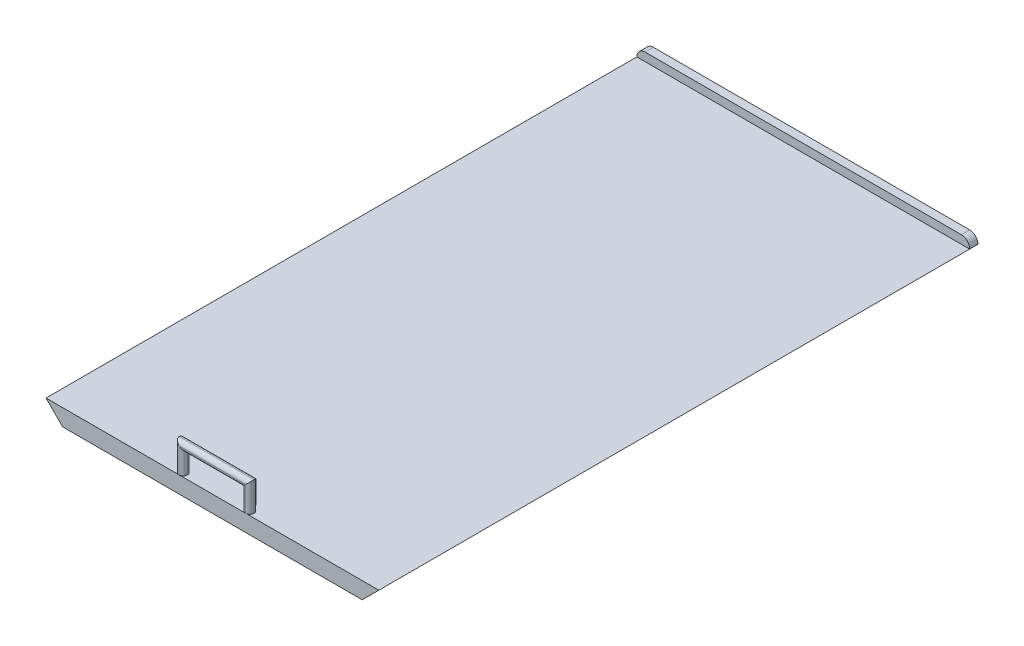
ISO-10303-21;
HEADER;
FILE_DESCRIPTION(('STEP AP214'),'2;1');
FILE_NAME('part.step','',(''),(''),'','','');
FILE_SCHEMA(('AUTOMOTIVE_DESIGN { 1 0 10303 214 1 1 1 1 }'));
ENDSEC;
DATA;
#1=APPLICATION_CONTEXT('core data for automotive mechanical design processes');
#2=APPLICATION_PROTOCOL_DEFINITION('international standard','automotive_design',2000,#1);
#3=PRODUCT_CONTEXT('',#1,'mechanical');
#4=PRODUCT('Part','Part','',(#3));
#5=PRODUCT_RELATED_PRODUCT_CATEGORY('part','',(#4));
#6=PRODUCT_DEFINITION_FORMATION('','',#4);
#7=PRODUCT_DEFINITION_CONTEXT('part definition',#1,'design');
#8=PRODUCT_DEFINITION('design','',#6,#7);
#9=PRODUCT_DEFINITION_SHAPE('','',#8);
#10=(LENGTH_UNIT() NAMED_UNIT(*) SI_UNIT(.MILLI.,.METRE.));
#11=(NAMED_UNIT(*) PLANE_ANGLE_UNIT() SI_UNIT($,.RADIAN.));
#12=(NAMED_UNIT(*) SI_UNIT($,.STERADIAN.) SOLID_ANGLE_UNIT());
#13=UNCERTAINTY_MEASURE_WITH_UNIT(LENGTH_MEASURE(1.E-05),#10,'distance_accuracy_value','');
#14=(GEOMETRIC_REPRESENTATION_CONTEXT(3) GLOBAL_UNCERTAINTY_ASSIGNED_CONTEXT((#13)) GLOBAL_UNIT_ASSIGNED_CONTEXT((#10,
#11,#12)) REPRESENTATION_CONTEXT('',''));
#15=CARTESIAN_POINT('',(0.,0.,0.));
#16=DIRECTION('',(0.,0.,1.));
#17=DIRECTION('',(1.,0.,0.));
#18=AXIS2_PLACEMENT_3D('',#15,#16,#17);
#19=CARTESIAN_POINT('',(0.,0.,1.));
#20=DIRECTION('',(0.,-1.,0.));
#21=DIRECTION('',(0.,0.,-1.));
#22=AXIS2_PLACEMENT_3D('',#19,#20,#21);
#23=PLANE('',#22);
#24=DIRECTION('',(-1.,0.,0.));
#25=VECTOR('',#24,1.);
#26=CARTESIAN_POINT('',(0.,0.,0.));
#27=LINE('',#26,#25);
#28=CARTESIAN_POINT('',(40.,0.,0.));
#29=VERTEX_POINT('',#28);
#30=CARTESIAN_POINT('',(0.,0.,0.));
#31=VERTEX_POINT('',#30);
#32=EDGE_CURVE('E120',#29,#31,#27,.T.);
#33=ORIENTED_EDGE('',*,*,#32,.F.);
#34=DIRECTION('',(0.,0.,-1.));
#35=VECTOR('',#34,1.);
#36=CARTESIAN_POINT('',(40.,0.,1.));
#37=LINE('',#36,#35);
#38=CARTESIAN_POINT('',(40.,0.,1.));
#39=VERTEX_POINT('',#38);
#40=EDGE_CURVE('E98',#39,#29,#37,.T.);
#41=ORIENTED_EDGE('',*,*,#40,.F.);
#42=DIRECTION('',(-1.,0.,0.));
#43=VECTOR('',#42,1.);
#44=CARTESIAN_POINT('',(0.,0.,1.));
#45=LINE('',#44,#43);
#46=CARTESIAN_POINT('',(0.,0.,1.));
#47=VERTEX_POINT('',#46);
#48=EDGE_CURVE('E88',#39,#47,#45,.T.);
#49=ORIENTED_EDGE('',*,*,#48,.T.);
#50=DIRECTION('',(0.,0.,-1.));
#51=VECTOR('',#50,1.);
#52=CARTESIAN_POINT('',(0.,0.,1.));
#53=LINE('',#52,#51);
#54=EDGE_CURVE('E95',#47,#31,#53,.T.);
#55=ORIENTED_EDGE('',*,*,#54,.T.);
#56=EDGE_LOOP('',(#33,#41,#49,#55));
#57=FACE_BOUND('',#56,.T.);
#58=ADVANCED_FACE('F47',(#57),#23,.T.);
#59=CARTESIAN_POINT('',(0.,1.,1.));
#60=DIRECTION('',(0.,1.,0.));
#61=DIRECTION('',(0.,0.,1.));
#62=AXIS2_PLACEMENT_3D('',#59,#60,#61);
#63=PLANE('',#62);
#64=DIRECTION('',(1.,0.,0.));
#65=VECTOR('',#64,1.);
#66=CARTESIAN_POINT('',(0.,1.,0.));
#67=LINE('',#66,#65);
#68=CARTESIAN_POINT('',(1.,1.,0.));
#69=VERTEX_POINT('',#68);
#70=CARTESIAN_POINT('',(39.,1.,0.));
#71=VERTEX_POINT('',#70);
#72=EDGE_CURVE('E99',#69,#71,#67,.T.);
#73=ORIENTED_EDGE('',*,*,#72,.F.);
#74=DIRECTION('',(0.,0.,-1.));
#75=VECTOR('',#74,1.);
#76=CARTESIAN_POINT('',(1.,1.,1.));
#77=LINE('',#76,#75);
#78=CARTESIAN_POINT('',(1.,1.,1.));
#79=VERTEX_POINT('',#78);
#80=EDGE_CURVE('E68',#69,#79,#77,.F.);
#81=ORIENTED_EDGE('',*,*,#80,.T.);
#82=DIRECTION('',(1.,0.,0.));
#83=VECTOR('',#82,1.);
#84=CARTESIAN_POINT('',(0.,1.,1.));
#85=LINE('',#84,#83);
#86=CARTESIAN_POINT('',(39.,1.,1.));
#87=VERTEX_POINT('',#86);
#88=EDGE_CURVE('E89',#79,#87,#85,.T.);
#89=ORIENTED_EDGE('',*,*,#88,.T.);
#90=DIRECTION('',(0.,0.,-1.));
#91=VECTOR('',#90,1.);
#92=CARTESIAN_POINT('',(39.,1.,1.));
#93=LINE('',#92,#91);
#94=EDGE_CURVE('E111',#87,#71,#93,.T.);
#95=ORIENTED_EDGE('',*,*,#94,.T.);
#96=EDGE_LOOP('',(#73,#81,#89,#95));
#97=FACE_BOUND('',#96,.T.);
#98=ADVANCED_FACE('F116',(#97),#63,.T.);
#99=CARTESIAN_POINT('',(0.,0.,1.));
#100=DIRECTION('',(0.,0.,1.));
#101=DIRECTION('',(1.,0.,0.));
#102=AXIS2_PLACEMENT_3D('',#99,#100,#101);
#103=PLANE('',#102);
#104=ORIENTED_EDGE('',*,*,#88,.F.);
#105=CARTESIAN_POINT('',(1.,0.,1.));
#106=DIRECTION('',(0.,0.,1.));
#107=DIRECTION('',(1.,0.,0.));
#108=AXIS2_PLACEMENT_3D('',#105,#106,#107);
#109=CIRCLE('',#108,1.);
#110=EDGE_CURVE('E12',#79,#47,#109,.T.);
#111=ORIENTED_EDGE('',*,*,#110,.T.);
#112=ORIENTED_EDGE('',*,*,#48,.F.);
#113=CARTESIAN_POINT('',(39.,0.,1.));
#114=DIRECTION('',(0.,0.,1.));
#115=DIRECTION('',(1.,0.,0.));
#116=AXIS2_PLACEMENT_3D('',#113,#114,#115);
#117=CIRCLE('',#116,1.);
#118=EDGE_CURVE('E55',#39,#87,#117,.T.);
#119=ORIENTED_EDGE('',*,*,#118,.T.);
#120=EDGE_LOOP('',(#104,#111,#112,#119));
#121=FACE_BOUND('',#120,.T.);
#122=ADVANCED_FACE('F87',(#121),#103,.T.);
#123=CARTESIAN_POINT('',(0.,0.,0.));
#124=DIRECTION('',(0.,0.,1.));
#125=DIRECTION('',(1.,0.,0.));
#126=AXIS2_PLACEMENT_3D('',#123,#124,#125);
#127=PLANE('',#126);
#128=ORIENTED_EDGE('',*,*,#32,.T.);
#129=CARTESIAN_POINT('',(1.,0.,0.));
#130=DIRECTION('',(0.,0.,1.));
#131=DIRECTION('',(1.,0.,0.));
#132=AXIS2_PLACEMENT_3D('',#129,#130,#131);
#133=CIRCLE('',#132,1.);
#134=EDGE_CURVE('E102',#31,#69,#133,.F.);
#135=ORIENTED_EDGE('',*,*,#134,.T.);
#136=ORIENTED_EDGE('',*,*,#72,.T.);
#137=CARTESIAN_POINT('',(39.,0.,0.));
#138=DIRECTION('',(0.,0.,1.));
#139=DIRECTION('',(1.,0.,0.));
#140=AXIS2_PLACEMENT_3D('',#137,#138,#139);
#141=CIRCLE('',#140,1.);
#142=EDGE_CURVE('E104',#71,#29,#141,.F.);
#143=ORIENTED_EDGE('',*,*,#142,.T.);
#144=EDGE_LOOP('',(#128,#135,#136,#143));
#145=FACE_BOUND('',#144,.T.);
#146=ADVANCED_FACE('F119',(#145),#127,.F.);
#147=CARTESIAN_POINT('',(1.,0.,1.));
#148=DIRECTION('',(0.,0.,-1.));
#149=DIRECTION('',(-1.,0.,0.));
#150=AXIS2_PLACEMENT_3D('',#147,#148,#149);
#151=CYLINDRICAL_SURFACE('',#150,1.);
#152=ORIENTED_EDGE('',*,*,#110,.F.);
#153=ORIENTED_EDGE('',*,*,#80,.F.);
#154=ORIENTED_EDGE('',*,*,#134,.F.);
#155=ORIENTED_EDGE('',*,*,#54,.F.);
#156=EDGE_LOOP('',(#152,#153,#154,#155));
#157=FACE_BOUND('',#156,.T.);
#158=ADVANCED_FACE('F101',(#157),#151,.T.);
#159=CARTESIAN_POINT('',(39.,0.,1.));
#160=DIRECTION('',(0.,0.,-1.));
#161=DIRECTION('',(-1.,0.,0.));
#162=AXIS2_PLACEMENT_3D('',#159,#160,#161);
#163=CYLINDRICAL_SURFACE('',#162,1.);
#164=ORIENTED_EDGE('',*,*,#118,.F.);
#165=ORIENTED_EDGE('',*,*,#40,.T.);
#166=ORIENTED_EDGE('',*,*,#142,.F.);
#167=ORIENTED_EDGE('',*,*,#94,.F.);
#168=EDGE_LOOP('',(#164,#165,#166,#167));
#169=FACE_BOUND('',#168,.T.);
#170=ADVANCED_FACE('F49',(#169),#163,.T.);
#171=CLOSED_SHELL('',(#58,#98,#122,#146,#158,#170));
#172=MANIFOLD_SOLID_BREP('B2',#171);
#173=CARTESIAN_POINT('',(0.,0.,72.));
#174=DIRECTION('',(0.,-1.,0.));
#175=DIRECTION('',(0.,0.,-1.));
#176=AXIS2_PLACEMENT_3D('',#173,#174,#175);
#177=PLANE('',#176);
#178=DIRECTION('',(-1.,0.,0.));
#179=VECTOR('',#178,1.);
#180=CARTESIAN_POINT('',(0.,0.,72.));
#181=LINE('',#180,#179);
#182=CARTESIAN_POINT('',(16.,0.,72.));
#183=VERTEX_POINT('',#182);
#184=CARTESIAN_POINT('',(0.,0.,72.));
#185=VERTEX_POINT('',#184);
#186=EDGE_CURVE('E378',#183,#185,#181,.T.);
#187=ORIENTED_EDGE('',*,*,#186,.F.);
#188=CARTESIAN_POINT('',(16.,0.,71.5));
#189=DIRECTION('',(0.,-1.,0.));
#190=DIRECTION('',(0.,0.,-1.));
#191=AXIS2_PLACEMENT_3D('',#188,#189,#190);
#192=CIRCLE('',#191,0.5);
#193=CARTESIAN_POINT('',(15.5,0.,71.5));
#194=VERTEX_POINT('',#193);
#195=EDGE_CURVE('E45',#183,#194,#192,.T.);
#196=ORIENTED_EDGE('',*,*,#195,.T.);
#197=CARTESIAN_POINT('',(16.,0.,71.5));
#198=DIRECTION('',(0.,-1.,0.));
#199=DIRECTION('',(0.,0.,-1.));
#200=AXIS2_PLACEMENT_3D('',#197,#198,#199);
#201=CIRCLE('',#200,0.5);
#202=CARTESIAN_POINT('',(16.,0.,71.));
#203=VERTEX_POINT('',#202);
#204=EDGE_CURVE('E181',#194,#203,#201,.T.);
#205=ORIENTED_EDGE('',*,*,#204,.T.);
#206=CARTESIAN_POINT('',(16.,0.,71.5));
#207=DIRECTION('',(0.,-1.,0.));
#208=DIRECTION('',(0.,0.,-1.));
#209=AXIS2_PLACEMENT_3D('',#206,#207,#208);
#210=CIRCLE('',#209,0.5);
#211=CARTESIAN_POINT('',(16.5,0.,71.5));
#212=VERTEX_POINT('',#211);
#213=EDGE_CURVE('E287',#203,#212,#210,.T.);
#214=ORIENTED_EDGE('',*,*,#213,.T.);
#215=CARTESIAN_POINT('',(16.,0.,71.5));
#216=DIRECTION('',(0.,-1.,0.));
#217=DIRECTION('',(0.,0.,-1.));
#218=AXIS2_PLACEMENT_3D('',#215,#216,#217);
#219=CIRCLE('',#218,0.5);
#220=EDGE_CURVE('E277',#212,#183,#219,.T.);
#221=ORIENTED_EDGE('',*,*,#220,.T.);
#222=CARTESIAN_POINT('',(24.,0.,72.));
#223=VERTEX_POINT('',#222);
#224=EDGE_CURVE('E376',#223,#183,#181,.T.);
#225=ORIENTED_EDGE('',*,*,#224,.F.);
#226=CARTESIAN_POINT('',(24.,0.,71.5));
#227=DIRECTION('',(0.,-1.,0.));
#228=DIRECTION('',(0.,0.,-1.));
#229=AXIS2_PLACEMENT_3D('',#226,#227,#228);
#230=CIRCLE('',#229,0.5);
#231=CARTESIAN_POINT('',(23.5,0.,71.5));
#232=VERTEX_POINT('',#231);
#233=EDGE_CURVE('E272',#223,#232,#230,.T.);
#234=ORIENTED_EDGE('',*,*,#233,.T.);
#235=CARTESIAN_POINT('',(24.,0.,71.5));
#236=DIRECTION('',(0.,-1.,0.));
#237=DIRECTION('',(0.,0.,-1.));
#238=AXIS2_PLACEMENT_3D('',#235,#236,#237);
#239=CIRCLE('',#238,0.5);
#240=CARTESIAN_POINT('',(24.,0.,71.));
#241=VERTEX_POINT('',#240);
#242=EDGE_CURVE('E265',#232,#241,#239,.T.);
#243=ORIENTED_EDGE('',*,*,#242,.T.);
#244=CARTESIAN_POINT('',(24.,0.,71.5));
#245=DIRECTION('',(0.,-1.,0.));
#246=DIRECTION('',(0.,0.,-1.));
#247=AXIS2_PLACEMENT_3D('',#244,#245,#246);
#248=CIRCLE('',#247,0.5);
#249=CARTESIAN_POINT('',(24.5,0.,71.5));
#250=VERTEX_POINT('',#249);
#251=EDGE_CURVE('E269',#241,#250,#248,.T.);
#252=ORIENTED_EDGE('',*,*,#251,.T.);
#253=CARTESIAN_POINT('',(24.,0.,71.5));
#254=DIRECTION('',(0.,-1.,0.));
#255=DIRECTION('',(0.,0.,-1.));
#256=AXIS2_PLACEMENT_3D('',#253,#254,#255);
#257=CIRCLE('',#256,0.5);
#258=EDGE_CURVE('E298',#250,#223,#257,.T.);
#259=ORIENTED_EDGE('',*,*,#258,.T.);
#260=CARTESIAN_POINT('',(40.,0.,72.));
#261=VERTEX_POINT('',#260);
#262=EDGE_CURVE('E367',#261,#223,#181,.T.);
#263=ORIENTED_EDGE('',*,*,#262,.F.);
#264=DIRECTION('',(0.,0.,-1.));
#265=VECTOR('',#264,1.);
#266=CARTESIAN_POINT('',(40.,0.,72.));
#267=LINE('',#266,#265);
#268=CARTESIAN_POINT('',(40.,0.,0.));
#269=VERTEX_POINT('',#268);
#270=EDGE_CURVE('E369',#261,#269,#267,.T.);
#271=ORIENTED_EDGE('',*,*,#270,.T.);
#272=DIRECTION('',(-1.,0.,0.));
#273=VECTOR('',#272,1.);
#274=CARTESIAN_POINT('',(0.,0.,0.));
#275=LINE('',#274,#273);
#276=CARTESIAN_POINT('',(0.,0.,0.));
#277=VERTEX_POINT('',#276);
#278=EDGE_CURVE('E394',#269,#277,#275,.T.);
#279=ORIENTED_EDGE('',*,*,#278,.T.);
#280=DIRECTION('',(0.,0.,-1.));
#281=VECTOR('',#280,1.);
#282=CARTESIAN_POINT('',(0.,0.,72.));
#283=LINE('',#282,#281);
#284=EDGE_CURVE('E375',#185,#277,#283,.T.);
#285=ORIENTED_EDGE('',*,*,#284,.F.);
#286=EDGE_LOOP('',(#187,#196,#205,#214,#221,#225,#234,#243,#252,#259,#263,#271,#279,#285));
#287=FACE_BOUND('',#286,.T.);
#288=ADVANCED_FACE('F171',(#287),#177,.F.);
#289=CARTESIAN_POINT('',(0.,0.,72.));
#290=DIRECTION('',(0.707106781186549,0.707106781186546,0.));
#291=DIRECTION('',(-0.707106781186546,0.707106781186549,0.));
#292=AXIS2_PLACEMENT_3D('',#289,#290,#291);
#293=PLANE('',#292);
#294=DIRECTION('',(0.707106781186546,-0.707106781186549,0.));
#295=VECTOR('',#294,1.);
#296=CARTESIAN_POINT('',(0.,0.,0.));
#297=LINE('',#296,#295);
#298=CARTESIAN_POINT('',(1.99999999999999,-2.,0.));
#299=VERTEX_POINT('',#298);
#300=EDGE_CURVE('E395',#277,#299,#297,.T.);
#301=ORIENTED_EDGE('',*,*,#300,.T.);
#302=DIRECTION('',(0.,0.,-1.));
#303=VECTOR('',#302,1.);
#304=CARTESIAN_POINT('',(1.99999999999999,-2.,72.));
#305=LINE('',#304,#303);
#306=CARTESIAN_POINT('',(1.99999999999999,-2.,72.));
#307=VERTEX_POINT('',#306);
#308=EDGE_CURVE('E410',#307,#299,#305,.T.);
#309=ORIENTED_EDGE('',*,*,#308,.F.);
#310=DIRECTION('',(0.707106781186546,-0.707106781186549,0.));
#311=VECTOR('',#310,1.);
#312=CARTESIAN_POINT('',(0.,0.,72.));
#313=LINE('',#312,#311);
#314=EDGE_CURVE('E390',#185,#307,#313,.T.);
#315=ORIENTED_EDGE('',*,*,#314,.F.);
#316=ORIENTED_EDGE('',*,*,#284,.T.);
#317=EDGE_LOOP('',(#301,#309,#315,#316));
#318=FACE_BOUND('',#317,.T.);
#319=ADVANCED_FACE('F433',(#318),#293,.F.);
#320=CARTESIAN_POINT('',(1.99999999999999,-2.,72.));
#321=DIRECTION('',(0.,1.,0.));
#322=DIRECTION('',(0.,0.,1.));
#323=AXIS2_PLACEMENT_3D('',#320,#321,#322);
#324=PLANE('',#323);
#325=DIRECTION('',(1.,0.,0.));
#326=VECTOR('',#325,1.);
#327=CARTESIAN_POINT('',(1.99999999999999,-2.,0.));
#328=LINE('',#327,#326);
#329=CARTESIAN_POINT('',(38.,-2.,0.));
#330=VERTEX_POINT('',#329);
#331=EDGE_CURVE('E219',#299,#330,#328,.T.);
#332=ORIENTED_EDGE('',*,*,#331,.T.);
#333=DIRECTION('',(0.,0.,-1.));
#334=VECTOR('',#333,1.);
#335=CARTESIAN_POINT('',(38.,-2.,72.));
#336=LINE('',#335,#334);
#337=CARTESIAN_POINT('',(38.,-2.,72.));
#338=VERTEX_POINT('',#337);
#339=EDGE_CURVE('E407',#338,#330,#336,.T.);
#340=ORIENTED_EDGE('',*,*,#339,.F.);
#341=DIRECTION('',(1.,0.,0.));
#342=VECTOR('',#341,1.);
#343=CARTESIAN_POINT('',(1.99999999999999,-2.,72.));
#344=LINE('',#343,#342);
#345=EDGE_CURVE('E387',#307,#338,#344,.T.);
#346=ORIENTED_EDGE('',*,*,#345,.F.);
#347=ORIENTED_EDGE('',*,*,#308,.T.);
#348=EDGE_LOOP('',(#332,#340,#346,#347));
#349=FACE_BOUND('',#348,.T.);
#350=ADVANCED_FACE('F438',(#349),#324,.F.);
#351=CARTESIAN_POINT('',(38.,-2.,72.));
#352=DIRECTION('',(-0.707106781186546,0.707106781186549,0.));
#353=DIRECTION('',(-0.707106781186549,-0.707106781186546,0.));
#354=AXIS2_PLACEMENT_3D('',#351,#352,#353);
#355=PLANE('',#354);
#356=DIRECTION('',(0.707106781186549,0.707106781186546,0.));
#357=VECTOR('',#356,1.);
#358=CARTESIAN_POINT('',(38.,-2.,0.));
#359=LINE('',#358,#357);
#360=EDGE_CURVE('E401',#330,#269,#359,.T.);
#361=ORIENTED_EDGE('',*,*,#360,.T.);
#362=ORIENTED_EDGE('',*,*,#270,.F.);
#363=DIRECTION('',(0.707106781186549,0.707106781186546,0.));
#364=VECTOR('',#363,1.);
#365=CARTESIAN_POINT('',(38.,-2.,72.));
#366=LINE('',#365,#364);
#367=EDGE_CURVE('E384',#338,#261,#366,.T.);
#368=ORIENTED_EDGE('',*,*,#367,.F.);
#369=ORIENTED_EDGE('',*,*,#339,.T.);
#370=EDGE_LOOP('',(#361,#362,#368,#369));
#371=FACE_BOUND('',#370,.T.);
#372=ADVANCED_FACE('F443',(#371),#355,.F.);
#373=CARTESIAN_POINT('',(0.,0.,72.));
#374=DIRECTION('',(0.,0.,1.));
#375=DIRECTION('',(1.,0.,0.));
#376=AXIS2_PLACEMENT_3D('',#373,#374,#375);
#377=PLANE('',#376);
#378=ORIENTED_EDGE('',*,*,#262,.T.);
#379=ORIENTED_EDGE('',*,*,#224,.T.);
#380=ORIENTED_EDGE('',*,*,#186,.T.);
#381=ORIENTED_EDGE('',*,*,#314,.T.);
#382=ORIENTED_EDGE('',*,*,#345,.T.);
#383=ORIENTED_EDGE('',*,*,#367,.T.);
#384=EDGE_LOOP('',(#378,#379,#380,#381,#382,#383));
#385=FACE_BOUND('',#384,.T.);
#386=ADVANCED_FACE('F446',(#385),#377,.T.);
#387=CARTESIAN_POINT('',(0.,0.,0.));
#388=DIRECTION('',(0.,0.,1.));
#389=DIRECTION('',(1.,0.,0.));
#390=AXIS2_PLACEMENT_3D('',#387,#388,#389);
#391=PLANE('',#390);
#392=ORIENTED_EDGE('',*,*,#300,.F.);
#393=ORIENTED_EDGE('',*,*,#278,.F.);
#394=ORIENTED_EDGE('',*,*,#360,.F.);
#395=ORIENTED_EDGE('',*,*,#331,.F.);
#396=EDGE_LOOP('',(#392,#393,#394,#395));
#397=FACE_BOUND('',#396,.T.);
#398=ADVANCED_FACE('F430',(#397),#391,.F.);
#399=CARTESIAN_POINT('',(23.5,2.5,72.));
#400=DIRECTION('',(0.,1.,0.));
#401=DIRECTION('',(-1.,0.,0.));
#402=AXIS2_PLACEMENT_3D('',#399,#400,#401);
#403=PLANE('',#402);
#404=DIRECTION('',(1.,0.,0.));
#405=VECTOR('',#404,1.);
#406=CARTESIAN_POINT('',(23.5,2.5,71.));
#407=LINE('',#406,#405);
#408=CARTESIAN_POINT('',(16.,2.5,71.));
#409=VERTEX_POINT('',#408);
#410=CARTESIAN_POINT('',(24.,2.5,71.));
#411=VERTEX_POINT('',#410);
#412=EDGE_CURVE('E284',#409,#411,#407,.T.);
#413=ORIENTED_EDGE('',*,*,#412,.T.);
#414=CARTESIAN_POINT('',(24.,2.5,71.5));
#415=DIRECTION('',(0.,1.,0.));
#416=DIRECTION('',(-1.,0.,0.));
#417=AXIS2_PLACEMENT_3D('',#414,#415,#416);
#418=CIRCLE('',#417,0.5);
#419=CARTESIAN_POINT('',(23.5,2.5,71.5));
#420=VERTEX_POINT('',#419);
#421=EDGE_CURVE('E276',#411,#420,#418,.T.);
#422=ORIENTED_EDGE('',*,*,#421,.T.);
#423=DIRECTION('',(1.,0.,0.));
#424=VECTOR('',#423,1.);
#425=CARTESIAN_POINT('',(16.5,2.5,71.5));
#426=LINE('',#425,#424);
#427=CARTESIAN_POINT('',(16.5,2.5,71.5));
#428=VERTEX_POINT('',#427);
#429=EDGE_CURVE('E361',#420,#428,#426,.F.);
#430=ORIENTED_EDGE('',*,*,#429,.T.);
#431=CARTESIAN_POINT('',(16.,2.5,71.5));
#432=DIRECTION('',(0.,1.,0.));
#433=DIRECTION('',(-1.,0.,0.));
#434=AXIS2_PLACEMENT_3D('',#431,#432,#433);
#435=CIRCLE('',#434,0.5);
#436=EDGE_CURVE('E292',#428,#409,#435,.T.);
#437=ORIENTED_EDGE('',*,*,#436,.T.);
#438=EDGE_LOOP('',(#413,#422,#430,#437));
#439=FACE_BOUND('',#438,.T.);
#440=ADVANCED_FACE('F417',(#439),#403,.F.);
#441=CARTESIAN_POINT('',(0.,0.,71.));
#442=DIRECTION('',(0.,0.,-1.));
#443=DIRECTION('',(-1.,0.,0.));
#444=AXIS2_PLACEMENT_3D('',#441,#442,#443);
#445=PLANE('',#444);
#446=DIRECTION('',(0.,1.,0.));
#447=VECTOR('',#446,1.);
#448=CARTESIAN_POINT('',(24.,0.,71.));
#449=LINE('',#448,#447);
#450=CARTESIAN_POINT('',(24.,3.,71.));
#451=VERTEX_POINT('',#450);
#452=EDGE_CURVE('E341',#451,#411,#449,.F.);
#453=ORIENTED_EDGE('',*,*,#452,.T.);
#454=ORIENTED_EDGE('',*,*,#412,.F.);
#455=DIRECTION('',(0.,-1.,0.));
#456=VECTOR('',#455,1.);
#457=CARTESIAN_POINT('',(16.,3.5,71.));
#458=LINE('',#457,#456);
#459=CARTESIAN_POINT('',(16.,3.,71.));
#460=VERTEX_POINT('',#459);
#461=EDGE_CURVE('E412',#409,#460,#458,.F.);
#462=ORIENTED_EDGE('',*,*,#461,.T.);
#463=DIRECTION('',(-1.,0.,0.));
#464=VECTOR('',#463,1.);
#465=CARTESIAN_POINT('',(24.5,3.,71.));
#466=LINE('',#465,#464);
#467=EDGE_CURVE('E346',#460,#451,#466,.F.);
#468=ORIENTED_EDGE('',*,*,#467,.T.);
#469=EDGE_LOOP('',(#453,#454,#462,#468));
#470=FACE_BOUND('',#469,.T.);
#471=ADVANCED_FACE('F423',(#470),#445,.T.);
#472=CARTESIAN_POINT('',(24.,0.,71.5));
#473=DIRECTION('',(0.,-1.,0.));
#474=DIRECTION('',(0.,0.,-1.));
#475=AXIS2_PLACEMENT_3D('',#472,#473,#474);
#476=CYLINDRICAL_SURFACE('',#475,0.5);
#477=DIRECTION('',(0.,1.,0.));
#478=VECTOR('',#477,1.);
#479=CARTESIAN_POINT('',(24.,3.5,72.));
#480=LINE('',#479,#478);
#481=CARTESIAN_POINT('',(24.,3.,72.));
#482=VERTEX_POINT('',#481);
#483=EDGE_CURVE('E335',#223,#482,#480,.T.);
#484=ORIENTED_EDGE('',*,*,#483,.F.);
#485=ORIENTED_EDGE('',*,*,#258,.F.);
#486=DIRECTION('',(0.,1.,0.));
#487=VECTOR('',#486,1.);
#488=CARTESIAN_POINT('',(24.5,0.,71.5));
#489=LINE('',#488,#487);
#490=CARTESIAN_POINT('',(24.5,3.5,71.5));
#491=VERTEX_POINT('',#490);
#492=EDGE_CURVE('E211',#491,#250,#489,.F.);
#493=ORIENTED_EDGE('',*,*,#492,.F.);
#494=CARTESIAN_POINT('',(24.,3.,71.5));
#495=DIRECTION('',(0.707106781186547,-0.707106781186547,0.));
#496=DIRECTION('',(-0.707106781186547,-0.707106781186547,0.));
#497=AXIS2_PLACEMENT_3D('',#494,#495,#496);
#498=ELLIPSE('',#497,0.707106781186547,0.5);
#499=EDGE_CURVE('E206',#482,#491,#498,.F.);
#500=ORIENTED_EDGE('',*,*,#499,.F.);
#501=EDGE_LOOP('',(#484,#485,#493,#500));
#502=FACE_BOUND('',#501,.T.);
#503=ADVANCED_FACE('F173',(#502),#476,.T.);
#504=CARTESIAN_POINT('',(24.,0.,71.5));
#505=DIRECTION('',(0.,1.,0.));
#506=DIRECTION('',(0.,0.,1.));
#507=AXIS2_PLACEMENT_3D('',#504,#505,#506);
#508=CYLINDRICAL_SURFACE('',#507,0.5);
#509=DIRECTION('',(0.,-1.,0.));
#510=VECTOR('',#509,1.);
#511=CARTESIAN_POINT('',(23.5,0.,71.5));
#512=LINE('',#511,#510);
#513=EDGE_CURVE('E333',#420,#232,#512,.T.);
#514=ORIENTED_EDGE('',*,*,#513,.F.);
#515=ORIENTED_EDGE('',*,*,#421,.F.);
#516=DIRECTION('',(0.,-1.,0.));
#517=VECTOR('',#516,1.);
#518=CARTESIAN_POINT('',(24.,2.5,71.));
#519=LINE('',#518,#517);
#520=EDGE_CURVE('E175',#241,#411,#519,.F.);
#521=ORIENTED_EDGE('',*,*,#520,.F.);
#522=ORIENTED_EDGE('',*,*,#242,.F.);
#523=EDGE_LOOP('',(#514,#515,#521,#522));
#524=FACE_BOUND('',#523,.T.);
#525=ADVANCED_FACE('F281',(#524),#508,.T.);
#526=CARTESIAN_POINT('',(24.,3.5,71.5));
#527=DIRECTION('',(0.,-1.,0.));
#528=DIRECTION('',(0.,0.,-1.));
#529=AXIS2_PLACEMENT_3D('',#526,#527,#528);
#530=CYLINDRICAL_SURFACE('',#529,0.5);
#531=ORIENTED_EDGE('',*,*,#520,.T.);
#532=ORIENTED_EDGE('',*,*,#452,.F.);
#533=CARTESIAN_POINT('',(24.,3.,71.5));
#534=DIRECTION('',(0.707106781186547,-0.707106781186547,0.));
#535=DIRECTION('',(0.707106781186547,0.707106781186547,0.));
#536=AXIS2_PLACEMENT_3D('',#533,#534,#535);
#537=ELLIPSE('',#536,0.707106781186547,0.5);
#538=EDGE_CURVE('E330',#491,#451,#537,.F.);
#539=ORIENTED_EDGE('',*,*,#538,.F.);
#540=ORIENTED_EDGE('',*,*,#492,.T.);
#541=ORIENTED_EDGE('',*,*,#251,.F.);
#542=EDGE_LOOP('',(#531,#532,#539,#540,#541));
#543=FACE_BOUND('',#542,.T.);
#544=ADVANCED_FACE('F285',(#543),#530,.T.);
#545=CARTESIAN_POINT('',(0.,3.,71.5));
#546=DIRECTION('',(1.,0.,0.));
#547=DIRECTION('',(0.,0.,-1.));
#548=AXIS2_PLACEMENT_3D('',#545,#546,#547);
#549=CYLINDRICAL_SURFACE('',#548,0.5);
#550=DIRECTION('',(-1.,0.,0.));
#551=VECTOR('',#550,1.);
#552=CARTESIAN_POINT('',(15.5,3.,72.));
#553=LINE('',#552,#551);
#554=CARTESIAN_POINT('',(16.,3.,72.));
#555=VERTEX_POINT('',#554);
#556=EDGE_CURVE('E321',#482,#555,#553,.T.);
#557=ORIENTED_EDGE('',*,*,#556,.F.);
#558=ORIENTED_EDGE('',*,*,#499,.T.);
#559=DIRECTION('',(-1.,0.,0.));
#560=VECTOR('',#559,1.);
#561=CARTESIAN_POINT('',(24.5,3.5,71.5));
#562=LINE('',#561,#560);
#563=CARTESIAN_POINT('',(15.5,3.5,71.5));
#564=VERTEX_POINT('',#563);
#565=EDGE_CURVE('E327',#564,#491,#562,.F.);
#566=ORIENTED_EDGE('',*,*,#565,.F.);
#567=CARTESIAN_POINT('',(16.,3.,71.5));
#568=DIRECTION('',(0.707106781186547,0.707106781186547,0.));
#569=DIRECTION('',(-0.707106781186547,0.707106781186547,0.));
#570=AXIS2_PLACEMENT_3D('',#567,#568,#569);
#571=ELLIPSE('',#570,0.707106781186547,0.5);
#572=EDGE_CURVE('E324',#555,#564,#571,.F.);
#573=ORIENTED_EDGE('',*,*,#572,.F.);
#574=EDGE_LOOP('',(#557,#558,#566,#573));
#575=FACE_BOUND('',#574,.T.);
#576=ADVANCED_FACE('F339',(#575),#549,.T.);
#577=CARTESIAN_POINT('',(24.,0.,71.5));
#578=DIRECTION('',(0.,1.,0.));
#579=DIRECTION('',(0.,0.,1.));
#580=AXIS2_PLACEMENT_3D('',#577,#578,#579);
#581=CYLINDRICAL_SURFACE('',#580,0.5);
#582=ORIENTED_EDGE('',*,*,#233,.F.);
#583=ORIENTED_EDGE('',*,*,#483,.T.);
#584=CARTESIAN_POINT('',(24.,3.,71.5));
#585=DIRECTION('',(-0.707106781186548,0.707106781186547,0.));
#586=DIRECTION('',(-0.707106781186547,-0.707106781186548,0.));
#587=AXIS2_PLACEMENT_3D('',#584,#585,#586);
#588=ELLIPSE('',#587,0.707106781186548,0.5);
#589=EDGE_CURVE('E318',#420,#482,#588,.T.);
#590=ORIENTED_EDGE('',*,*,#589,.F.);
#591=ORIENTED_EDGE('',*,*,#513,.T.);
#592=EDGE_LOOP('',(#582,#583,#590,#591));
#593=FACE_BOUND('',#592,.T.);
#594=ADVANCED_FACE('F363',(#593),#581,.T.);
#595=CARTESIAN_POINT('',(24.5,3.,71.5));
#596=DIRECTION('',(1.,0.,0.));
#597=DIRECTION('',(0.,0.,-1.));
#598=AXIS2_PLACEMENT_3D('',#595,#596,#597);
#599=CYLINDRICAL_SURFACE('',#598,0.5);
#600=ORIENTED_EDGE('',*,*,#538,.T.);
#601=ORIENTED_EDGE('',*,*,#467,.F.);
#602=CARTESIAN_POINT('',(16.,3.,71.5));
#603=DIRECTION('',(0.707106781186547,0.707106781186547,0.));
#604=DIRECTION('',(-0.707106781186547,0.707106781186547,0.));
#605=AXIS2_PLACEMENT_3D('',#602,#603,#604);
#606=ELLIPSE('',#605,0.707106781186547,0.5);
#607=EDGE_CURVE('E315',#564,#460,#606,.F.);
#608=ORIENTED_EDGE('',*,*,#607,.F.);
#609=ORIENTED_EDGE('',*,*,#565,.T.);
#610=EDGE_LOOP('',(#600,#601,#608,#609));
#611=FACE_BOUND('',#610,.T.);
#612=ADVANCED_FACE('F345',(#611),#599,.T.);
#613=CARTESIAN_POINT('',(16.,0.,71.5));
#614=DIRECTION('',(0.,1.,0.));
#615=DIRECTION('',(0.,0.,1.));
#616=AXIS2_PLACEMENT_3D('',#613,#614,#615);
#617=CYLINDRICAL_SURFACE('',#616,0.5);
#618=DIRECTION('',(0.,-1.,0.));
#619=VECTOR('',#618,1.);
#620=CARTESIAN_POINT('',(16.,0.,72.));
#621=LINE('',#620,#619);
#622=EDGE_CURVE('E309',#555,#183,#621,.T.);
#623=ORIENTED_EDGE('',*,*,#622,.F.);
#624=ORIENTED_EDGE('',*,*,#572,.T.);
#625=DIRECTION('',(0.,-1.,0.));
#626=VECTOR('',#625,1.);
#627=CARTESIAN_POINT('',(15.5,3.5,71.5));
#628=LINE('',#627,#626);
#629=EDGE_CURVE('E312',#194,#564,#628,.F.);
#630=ORIENTED_EDGE('',*,*,#629,.F.);
#631=ORIENTED_EDGE('',*,*,#195,.F.);
#632=EDGE_LOOP('',(#623,#624,#630,#631));
#633=FACE_BOUND('',#632,.T.);
#634=ADVANCED_FACE('F354',(#633),#617,.T.);
#635=CARTESIAN_POINT('',(0.,3.,71.5));
#636=DIRECTION('',(-1.,0.,0.));
#637=DIRECTION('',(0.,-1.,0.));
#638=AXIS2_PLACEMENT_3D('',#635,#636,#637);
#639=CYLINDRICAL_SURFACE('',#638,0.5);
#640=ORIENTED_EDGE('',*,*,#589,.T.);
#641=ORIENTED_EDGE('',*,*,#556,.T.);
#642=CARTESIAN_POINT('',(16.,3.,71.5));
#643=DIRECTION('',(-0.707106781186547,-0.707106781186548,0.));
#644=DIRECTION('',(0.707106781186548,-0.707106781186547,0.));
#645=AXIS2_PLACEMENT_3D('',#642,#643,#644);
#646=ELLIPSE('',#645,0.707106781186547,0.5);
#647=EDGE_CURVE('E306',#428,#555,#646,.T.);
#648=ORIENTED_EDGE('',*,*,#647,.F.);
#649=ORIENTED_EDGE('',*,*,#429,.F.);
#650=EDGE_LOOP('',(#640,#641,#648,#649));
#651=FACE_BOUND('',#650,.T.);
#652=ADVANCED_FACE('F357',(#651),#639,.T.);
#653=CARTESIAN_POINT('',(16.,3.5,71.5));
#654=DIRECTION('',(0.,1.,0.));
#655=DIRECTION('',(0.,0.,1.));
#656=AXIS2_PLACEMENT_3D('',#653,#654,#655);
#657=CYLINDRICAL_SURFACE('',#656,0.5);
#658=ORIENTED_EDGE('',*,*,#607,.T.);
#659=ORIENTED_EDGE('',*,*,#461,.F.);
#660=DIRECTION('',(0.,-1.,0.));
#661=VECTOR('',#660,1.);
#662=CARTESIAN_POINT('',(16.,3.5,71.));
#663=LINE('',#662,#661);
#664=EDGE_CURVE('E303',#203,#409,#663,.F.);
#665=ORIENTED_EDGE('',*,*,#664,.F.);
#666=ORIENTED_EDGE('',*,*,#204,.F.);
#667=ORIENTED_EDGE('',*,*,#629,.T.);
#668=EDGE_LOOP('',(#658,#659,#665,#666,#667));
#669=FACE_BOUND('',#668,.T.);
#670=ADVANCED_FACE('F350',(#669),#657,.T.);
#671=CARTESIAN_POINT('',(16.,0.,71.5));
#672=DIRECTION('',(0.,-1.,0.));
#673=DIRECTION('',(0.,0.,-1.));
#674=AXIS2_PLACEMENT_3D('',#671,#672,#673);
#675=CYLINDRICAL_SURFACE('',#674,0.5);
#676=ORIENTED_EDGE('',*,*,#622,.T.);
#677=ORIENTED_EDGE('',*,*,#220,.F.);
#678=DIRECTION('',(0.,1.,0.));
#679=VECTOR('',#678,1.);
#680=CARTESIAN_POINT('',(16.5,0.,71.5));
#681=LINE('',#680,#679);
#682=EDGE_CURVE('E301',#428,#212,#681,.F.);
#683=ORIENTED_EDGE('',*,*,#682,.F.);
#684=ORIENTED_EDGE('',*,*,#647,.T.);
#685=EDGE_LOOP('',(#676,#677,#683,#684));
#686=FACE_BOUND('',#685,.T.);
#687=ADVANCED_FACE('F453',(#686),#675,.T.);
#688=CARTESIAN_POINT('',(16.,2.5,71.5));
#689=DIRECTION('',(0.,-1.,0.));
#690=DIRECTION('',(0.,0.,-1.));
#691=AXIS2_PLACEMENT_3D('',#688,#689,#690);
#692=CYLINDRICAL_SURFACE('',#691,0.5);
#693=ORIENTED_EDGE('',*,*,#213,.F.);
#694=ORIENTED_EDGE('',*,*,#664,.T.);
#695=ORIENTED_EDGE('',*,*,#436,.F.);
#696=ORIENTED_EDGE('',*,*,#682,.T.);
#697=EDGE_LOOP('',(#693,#694,#695,#696));
#698=FACE_BOUND('',#697,.T.);
#699=ADVANCED_FACE('F420',(#698),#692,.T.);
#700=CLOSED_SHELL('',(#288,#319,#350,#372,#386,#398,#440,#471,#503,#525,#544,#576,#594,#612,
#634,#652,#670,#687,#699));
#701=MANIFOLD_SOLID_BREP('B6',#700);
#702=ADVANCED_BREP_SHAPE_REPRESENTATION('',(#18,#172,#701),#14);
#703=SHAPE_DEFINITION_REPRESENTATION(#9,#702);
ENDSEC;
END-ISO-10303-21;
